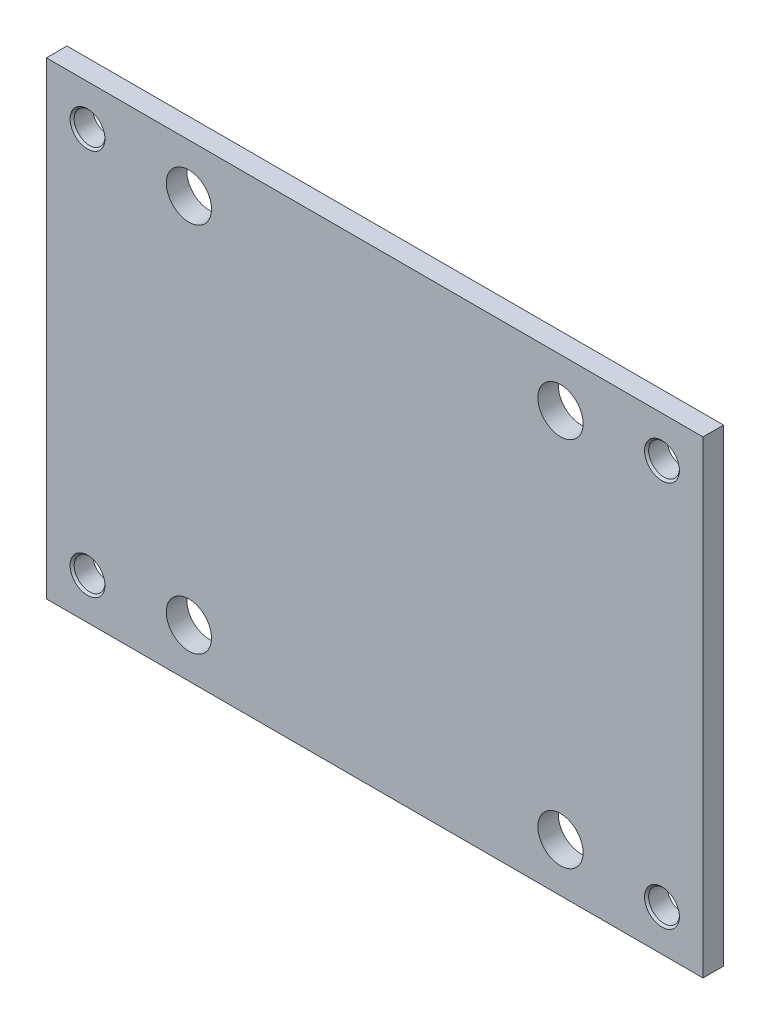
ISO-10303-21;
HEADER;
FILE_DESCRIPTION(('STEP AP214'),'2;1');
FILE_NAME('part.step','',(''),(''),'','','');
FILE_SCHEMA(('AUTOMOTIVE_DESIGN { 1 0 10303 214 1 1 1 1 }'));
ENDSEC;
DATA;
#1=APPLICATION_CONTEXT('core data for automotive mechanical design processes');
#2=APPLICATION_PROTOCOL_DEFINITION('international standard','automotive_design',2000,#1);
#3=PRODUCT_CONTEXT('',#1,'mechanical');
#4=PRODUCT('Part','Part','',(#3));
#5=PRODUCT_RELATED_PRODUCT_CATEGORY('part','',(#4));
#6=PRODUCT_DEFINITION_FORMATION('','',#4);
#7=PRODUCT_DEFINITION_CONTEXT('part definition',#1,'design');
#8=PRODUCT_DEFINITION('design','',#6,#7);
#9=PRODUCT_DEFINITION_SHAPE('','',#8);
#10=(LENGTH_UNIT() NAMED_UNIT(*) SI_UNIT(.MILLI.,.METRE.));
#11=(NAMED_UNIT(*) PLANE_ANGLE_UNIT() SI_UNIT($,.RADIAN.));
#12=(NAMED_UNIT(*) SI_UNIT($,.STERADIAN.) SOLID_ANGLE_UNIT());
#13=UNCERTAINTY_MEASURE_WITH_UNIT(LENGTH_MEASURE(1.E-05),#10,'distance_accuracy_value','');
#14=(GEOMETRIC_REPRESENTATION_CONTEXT(3) GLOBAL_UNCERTAINTY_ASSIGNED_CONTEXT((#13)) GLOBAL_UNIT_ASSIGNED_CONTEXT((#10,
#11,#12)) REPRESENTATION_CONTEXT('',''));
#15=CARTESIAN_POINT('',(0.,0.,0.));
#16=DIRECTION('',(0.,0.,1.));
#17=DIRECTION('',(1.,0.,0.));
#18=AXIS2_PLACEMENT_3D('',#15,#16,#17);
#19=CARTESIAN_POINT('',(101.6,72.517,6.35));
#20=DIRECTION('',(-1.,0.,0.));
#21=DIRECTION('',(0.,-1.,0.));
#22=AXIS2_PLACEMENT_3D('',#19,#20,#21);
#23=PLANE('',#22);
#24=DIRECTION('',(0.,1.,0.));
#25=VECTOR('',#24,1.);
#26=CARTESIAN_POINT('',(101.6,72.517,0.));
#27=LINE('',#26,#25);
#28=CARTESIAN_POINT('',(101.6,-72.517,0.));
#29=VERTEX_POINT('',#28);
#30=CARTESIAN_POINT('',(101.6,72.517,0.));
#31=VERTEX_POINT('',#30);
#32=EDGE_CURVE('E101',#29,#31,#27,.T.);
#33=ORIENTED_EDGE('',*,*,#32,.T.);
#34=DIRECTION('',(0.,0.,-1.));
#35=VECTOR('',#34,1.);
#36=CARTESIAN_POINT('',(101.6,72.517,6.35));
#37=LINE('',#36,#35);
#38=CARTESIAN_POINT('',(101.6,72.517,6.35));
#39=VERTEX_POINT('',#38);
#40=EDGE_CURVE('E11',#39,#31,#37,.T.);
#41=ORIENTED_EDGE('',*,*,#40,.F.);
#42=DIRECTION('',(0.,1.,0.));
#43=VECTOR('',#42,1.);
#44=CARTESIAN_POINT('',(101.6,72.517,6.35));
#45=LINE('',#44,#43);
#46=CARTESIAN_POINT('',(101.6,-72.517,6.35));
#47=VERTEX_POINT('',#46);
#48=EDGE_CURVE('E89',#47,#39,#45,.T.);
#49=ORIENTED_EDGE('',*,*,#48,.F.);
#50=DIRECTION('',(0.,0.,-1.));
#51=VECTOR('',#50,1.);
#52=CARTESIAN_POINT('',(101.6,-72.517,6.35));
#53=LINE('',#52,#51);
#54=EDGE_CURVE('E97',#47,#29,#53,.T.);
#55=ORIENTED_EDGE('',*,*,#54,.T.);
#56=EDGE_LOOP('',(#33,#41,#49,#55));
#57=FACE_BOUND('',#56,.T.);
#58=ADVANCED_FACE('F38',(#57),#23,.F.);
#59=CARTESIAN_POINT('',(-101.6,72.517,6.35));
#60=DIRECTION('',(0.,-1.,0.));
#61=DIRECTION('',(0.,0.,-1.));
#62=AXIS2_PLACEMENT_3D('',#59,#60,#61);
#63=PLANE('',#62);
#64=DIRECTION('',(-1.,0.,0.));
#65=VECTOR('',#64,1.);
#66=CARTESIAN_POINT('',(-101.6,72.517,0.));
#67=LINE('',#66,#65);
#68=CARTESIAN_POINT('',(-101.6,72.517,0.));
#69=VERTEX_POINT('',#68);
#70=EDGE_CURVE('E93',#31,#69,#67,.T.);
#71=ORIENTED_EDGE('',*,*,#70,.T.);
#72=DIRECTION('',(0.,0.,-1.));
#73=VECTOR('',#72,1.);
#74=CARTESIAN_POINT('',(-101.6,72.517,6.35));
#75=LINE('',#74,#73);
#76=CARTESIAN_POINT('',(-101.6,72.517,6.35));
#77=VERTEX_POINT('',#76);
#78=EDGE_CURVE('E46',#77,#69,#75,.T.);
#79=ORIENTED_EDGE('',*,*,#78,.F.);
#80=DIRECTION('',(-1.,0.,0.));
#81=VECTOR('',#80,1.);
#82=CARTESIAN_POINT('',(-101.6,72.517,6.35));
#83=LINE('',#82,#81);
#84=EDGE_CURVE('E84',#39,#77,#83,.T.);
#85=ORIENTED_EDGE('',*,*,#84,.F.);
#86=ORIENTED_EDGE('',*,*,#40,.T.);
#87=EDGE_LOOP('',(#71,#79,#85,#86));
#88=FACE_BOUND('',#87,.T.);
#89=ADVANCED_FACE('F92',(#88),#63,.F.);
#90=CARTESIAN_POINT('',(-101.6,72.517,6.35));
#91=DIRECTION('',(1.,0.,0.));
#92=DIRECTION('',(0.,1.,0.));
#93=AXIS2_PLACEMENT_3D('',#90,#91,#92);
#94=PLANE('',#93);
#95=DIRECTION('',(0.,-1.,0.));
#96=VECTOR('',#95,1.);
#97=CARTESIAN_POINT('',(-101.6,72.517,0.));
#98=LINE('',#97,#96);
#99=CARTESIAN_POINT('',(-101.6,-72.517,0.));
#100=VERTEX_POINT('',#99);
#101=EDGE_CURVE('E71',#69,#100,#98,.T.);
#102=ORIENTED_EDGE('',*,*,#101,.T.);
#103=DIRECTION('',(0.,0.,-1.));
#104=VECTOR('',#103,1.);
#105=CARTESIAN_POINT('',(-101.6,-72.517,6.35));
#106=LINE('',#105,#104);
#107=CARTESIAN_POINT('',(-101.6,-72.517,6.35));
#108=VERTEX_POINT('',#107);
#109=EDGE_CURVE('E94',#108,#100,#106,.T.);
#110=ORIENTED_EDGE('',*,*,#109,.F.);
#111=DIRECTION('',(0.,-1.,0.));
#112=VECTOR('',#111,1.);
#113=CARTESIAN_POINT('',(-101.6,72.517,6.35));
#114=LINE('',#113,#112);
#115=EDGE_CURVE('E87',#77,#108,#114,.T.);
#116=ORIENTED_EDGE('',*,*,#115,.F.);
#117=ORIENTED_EDGE('',*,*,#78,.T.);
#118=EDGE_LOOP('',(#102,#110,#116,#117));
#119=FACE_BOUND('',#118,.T.);
#120=ADVANCED_FACE('F95',(#119),#94,.F.);
#121=CARTESIAN_POINT('',(-101.6,-72.517,6.35));
#122=DIRECTION('',(0.,1.,0.));
#123=DIRECTION('',(0.,0.,1.));
#124=AXIS2_PLACEMENT_3D('',#121,#122,#123);
#125=PLANE('',#124);
#126=DIRECTION('',(1.,0.,0.));
#127=VECTOR('',#126,1.);
#128=CARTESIAN_POINT('',(-101.6,-72.517,0.));
#129=LINE('',#128,#127);
#130=EDGE_CURVE('E77',#100,#29,#129,.T.);
#131=ORIENTED_EDGE('',*,*,#130,.T.);
#132=ORIENTED_EDGE('',*,*,#54,.F.);
#133=DIRECTION('',(1.,0.,0.));
#134=VECTOR('',#133,1.);
#135=CARTESIAN_POINT('',(-101.6,-72.517,6.35));
#136=LINE('',#135,#134);
#137=EDGE_CURVE('E54',#108,#47,#136,.T.);
#138=ORIENTED_EDGE('',*,*,#137,.F.);
#139=ORIENTED_EDGE('',*,*,#109,.T.);
#140=EDGE_LOOP('',(#131,#132,#138,#139));
#141=FACE_BOUND('',#140,.T.);
#142=ADVANCED_FACE('F109',(#141),#125,.F.);
#143=CARTESIAN_POINT('',(0.,0.,6.35));
#144=DIRECTION('',(0.,0.,1.));
#145=DIRECTION('',(1.,0.,0.));
#146=AXIS2_PLACEMENT_3D('',#143,#144,#145);
#147=PLANE('',#146);
#148=CARTESIAN_POINT('',(57.4829999999999,-57.483,6.35));
#149=DIRECTION('',(0.,0.,-1.));
#150=DIRECTION('',(-1.,0.,0.));
#151=AXIS2_PLACEMENT_3D('',#148,#149,#150);
#152=CIRCLE('',#151,7.);
#153=CARTESIAN_POINT('',(50.483,-57.483,6.35));
#154=VERTEX_POINT('',#153);
#155=EDGE_CURVE('E160',#154,#154,#152,.T.);
#156=ORIENTED_EDGE('',*,*,#155,.T.);
#157=EDGE_LOOP('',(#156));
#158=FACE_BOUND('',#157,.T.);
#159=CARTESIAN_POINT('',(-57.5170000000001,-57.483,6.35));
#160=DIRECTION('',(0.,0.,-1.));
#161=DIRECTION('',(-1.,0.,0.));
#162=AXIS2_PLACEMENT_3D('',#159,#160,#161);
#163=CIRCLE('',#162,7.);
#164=CARTESIAN_POINT('',(-64.5170000000001,-57.483,6.35));
#165=VERTEX_POINT('',#164);
#166=EDGE_CURVE('E166',#165,#165,#163,.T.);
#167=ORIENTED_EDGE('',*,*,#166,.T.);
#168=EDGE_LOOP('',(#167));
#169=FACE_BOUND('',#168,.T.);
#170=CARTESIAN_POINT('',(-57.5170000000001,57.517,6.35));
#171=DIRECTION('',(0.,0.,-1.));
#172=DIRECTION('',(-1.,0.,0.));
#173=AXIS2_PLACEMENT_3D('',#170,#171,#172);
#174=CIRCLE('',#173,7.);
#175=CARTESIAN_POINT('',(-64.5170000000001,57.517,6.35));
#176=VERTEX_POINT('',#175);
#177=EDGE_CURVE('E154',#176,#176,#174,.T.);
#178=ORIENTED_EDGE('',*,*,#177,.T.);
#179=EDGE_LOOP('',(#178));
#180=FACE_BOUND('',#179,.T.);
#181=CARTESIAN_POINT('',(57.4829999999999,57.517,6.35));
#182=DIRECTION('',(0.,0.,-1.));
#183=DIRECTION('',(-1.,0.,0.));
#184=AXIS2_PLACEMENT_3D('',#181,#182,#183);
#185=CIRCLE('',#184,7.);
#186=CARTESIAN_POINT('',(50.483,57.517,6.35));
#187=VERTEX_POINT('',#186);
#188=EDGE_CURVE('E150',#187,#187,#185,.T.);
#189=ORIENTED_EDGE('',*,*,#188,.T.);
#190=EDGE_LOOP('',(#189));
#191=FACE_BOUND('',#190,.T.);
#192=CARTESIAN_POINT('',(-88.9,59.817,6.35));
#193=DIRECTION('',(0.,0.,1.));
#194=DIRECTION('',(1.,0.,0.));
#195=AXIS2_PLACEMENT_3D('',#192,#193,#194);
#196=CIRCLE('',#195,5.3975);
#197=CARTESIAN_POINT('',(-83.5025000000001,59.817,6.35));
#198=VERTEX_POINT('',#197);
#199=EDGE_CURVE('E147',#198,#198,#196,.T.);
#200=ORIENTED_EDGE('',*,*,#199,.F.);
#201=EDGE_LOOP('',(#200));
#202=FACE_BOUND('',#201,.T.);
#203=CARTESIAN_POINT('',(-88.9,-59.817,6.35));
#204=DIRECTION('',(0.,0.,1.));
#205=DIRECTION('',(1.,0.,0.));
#206=AXIS2_PLACEMENT_3D('',#203,#204,#205);
#207=CIRCLE('',#206,5.3975);
#208=CARTESIAN_POINT('',(-83.5025000000001,-59.817,6.35));
#209=VERTEX_POINT('',#208);
#210=EDGE_CURVE('E138',#209,#209,#207,.T.);
#211=ORIENTED_EDGE('',*,*,#210,.F.);
#212=EDGE_LOOP('',(#211));
#213=FACE_BOUND('',#212,.T.);
#214=CARTESIAN_POINT('',(88.9,-59.817,6.35));
#215=DIRECTION('',(0.,0.,1.));
#216=DIRECTION('',(1.,0.,0.));
#217=AXIS2_PLACEMENT_3D('',#214,#215,#216);
#218=CIRCLE('',#217,5.3975);
#219=CARTESIAN_POINT('',(94.2975,-59.817,6.35));
#220=VERTEX_POINT('',#219);
#221=EDGE_CURVE('E129',#220,#220,#218,.T.);
#222=ORIENTED_EDGE('',*,*,#221,.F.);
#223=EDGE_LOOP('',(#222));
#224=FACE_BOUND('',#223,.T.);
#225=CARTESIAN_POINT('',(88.8999999999999,59.817,6.35));
#226=DIRECTION('',(0.,0.,1.));
#227=DIRECTION('',(1.,0.,0.));
#228=AXIS2_PLACEMENT_3D('',#225,#226,#227);
#229=CIRCLE('',#228,5.3975);
#230=CARTESIAN_POINT('',(94.2975,59.817,6.35));
#231=VERTEX_POINT('',#230);
#232=EDGE_CURVE('E120',#231,#231,#229,.T.);
#233=ORIENTED_EDGE('',*,*,#232,.F.);
#234=EDGE_LOOP('',(#233));
#235=FACE_BOUND('',#234,.T.);
#236=ORIENTED_EDGE('',*,*,#48,.T.);
#237=ORIENTED_EDGE('',*,*,#84,.T.);
#238=ORIENTED_EDGE('',*,*,#115,.T.);
#239=ORIENTED_EDGE('',*,*,#137,.T.);
#240=EDGE_LOOP('',(#236,#237,#238,#239));
#241=FACE_BOUND('',#240,.T.);
#242=ADVANCED_FACE('F85',(#158,#169,#180,#191,#202,#213,#224,#235,#241),#147,.T.);
#243=CARTESIAN_POINT('',(0.,0.,0.));
#244=DIRECTION('',(0.,0.,1.));
#245=DIRECTION('',(1.,0.,0.));
#246=AXIS2_PLACEMENT_3D('',#243,#244,#245);
#247=PLANE('',#246);
#248=CARTESIAN_POINT('',(57.4829999999999,-57.483,0.));
#249=DIRECTION('',(0.,0.,-1.));
#250=DIRECTION('',(-1.,0.,0.));
#251=AXIS2_PLACEMENT_3D('',#248,#249,#250);
#252=CIRCLE('',#251,7.);
#253=CARTESIAN_POINT('',(50.483,-57.483,0.));
#254=VERTEX_POINT('',#253);
#255=EDGE_CURVE('E157',#254,#254,#252,.T.);
#256=ORIENTED_EDGE('',*,*,#255,.F.);
#257=EDGE_LOOP('',(#256));
#258=FACE_BOUND('',#257,.T.);
#259=CARTESIAN_POINT('',(-57.5170000000001,-57.483,0.));
#260=DIRECTION('',(0.,0.,-1.));
#261=DIRECTION('',(-1.,0.,0.));
#262=AXIS2_PLACEMENT_3D('',#259,#260,#261);
#263=CIRCLE('',#262,7.);
#264=CARTESIAN_POINT('',(-64.5170000000001,-57.483,0.));
#265=VERTEX_POINT('',#264);
#266=EDGE_CURVE('E163',#265,#265,#263,.T.);
#267=ORIENTED_EDGE('',*,*,#266,.F.);
#268=EDGE_LOOP('',(#267));
#269=FACE_BOUND('',#268,.T.);
#270=CARTESIAN_POINT('',(-57.5170000000001,57.517,0.));
#271=DIRECTION('',(0.,0.,-1.));
#272=DIRECTION('',(-1.,0.,0.));
#273=AXIS2_PLACEMENT_3D('',#270,#271,#272);
#274=CIRCLE('',#273,7.);
#275=CARTESIAN_POINT('',(-64.5170000000001,57.517,0.));
#276=VERTEX_POINT('',#275);
#277=EDGE_CURVE('E169',#276,#276,#274,.T.);
#278=ORIENTED_EDGE('',*,*,#277,.F.);
#279=EDGE_LOOP('',(#278));
#280=FACE_BOUND('',#279,.T.);
#281=CARTESIAN_POINT('',(57.4829999999999,57.517,0.));
#282=DIRECTION('',(0.,0.,-1.));
#283=DIRECTION('',(-1.,0.,0.));
#284=AXIS2_PLACEMENT_3D('',#281,#282,#283);
#285=CIRCLE('',#284,7.);
#286=CARTESIAN_POINT('',(50.483,57.517,0.));
#287=VERTEX_POINT('',#286);
#288=EDGE_CURVE('E151',#287,#287,#285,.T.);
#289=ORIENTED_EDGE('',*,*,#288,.F.);
#290=EDGE_LOOP('',(#289));
#291=FACE_BOUND('',#290,.T.);
#292=CARTESIAN_POINT('',(-88.9,59.817,0.));
#293=DIRECTION('',(0.,0.,1.));
#294=DIRECTION('',(1.,0.,0.));
#295=AXIS2_PLACEMENT_3D('',#292,#293,#294);
#296=CIRCLE('',#295,4.7625);
#297=CARTESIAN_POINT('',(-84.1375,59.817,0.));
#298=VERTEX_POINT('',#297);
#299=EDGE_CURVE('E141',#298,#298,#296,.T.);
#300=ORIENTED_EDGE('',*,*,#299,.T.);
#301=EDGE_LOOP('',(#300));
#302=FACE_BOUND('',#301,.T.);
#303=CARTESIAN_POINT('',(-88.9,-59.817,0.));
#304=DIRECTION('',(0.,0.,1.));
#305=DIRECTION('',(1.,0.,0.));
#306=AXIS2_PLACEMENT_3D('',#303,#304,#305);
#307=CIRCLE('',#306,4.7625);
#308=CARTESIAN_POINT('',(-84.1375,-59.817,0.));
#309=VERTEX_POINT('',#308);
#310=EDGE_CURVE('E132',#309,#309,#307,.T.);
#311=ORIENTED_EDGE('',*,*,#310,.T.);
#312=EDGE_LOOP('',(#311));
#313=FACE_BOUND('',#312,.T.);
#314=CARTESIAN_POINT('',(88.9,-59.817,0.));
#315=DIRECTION('',(0.,0.,1.));
#316=DIRECTION('',(1.,0.,0.));
#317=AXIS2_PLACEMENT_3D('',#314,#315,#316);
#318=CIRCLE('',#317,4.7625);
#319=CARTESIAN_POINT('',(93.6625,-59.817,0.));
#320=VERTEX_POINT('',#319);
#321=EDGE_CURVE('E123',#320,#320,#318,.T.);
#322=ORIENTED_EDGE('',*,*,#321,.T.);
#323=EDGE_LOOP('',(#322));
#324=FACE_BOUND('',#323,.T.);
#325=CARTESIAN_POINT('',(88.8999999999999,59.817,0.));
#326=DIRECTION('',(0.,0.,1.));
#327=DIRECTION('',(1.,0.,0.));
#328=AXIS2_PLACEMENT_3D('',#325,#326,#327);
#329=CIRCLE('',#328,4.7625);
#330=CARTESIAN_POINT('',(93.6625,59.817,0.));
#331=VERTEX_POINT('',#330);
#332=EDGE_CURVE('E104',#331,#331,#329,.T.);
#333=ORIENTED_EDGE('',*,*,#332,.T.);
#334=EDGE_LOOP('',(#333));
#335=FACE_BOUND('',#334,.T.);
#336=ORIENTED_EDGE('',*,*,#32,.F.);
#337=ORIENTED_EDGE('',*,*,#130,.F.);
#338=ORIENTED_EDGE('',*,*,#101,.F.);
#339=ORIENTED_EDGE('',*,*,#70,.F.);
#340=EDGE_LOOP('',(#336,#337,#338,#339));
#341=FACE_BOUND('',#340,.T.);
#342=ADVANCED_FACE('F112',(#258,#269,#280,#291,#302,#313,#324,#335,#341),#247,.F.);
#343=CARTESIAN_POINT('',(88.8999999999999,59.817,6.35));
#344=DIRECTION('',(0.,0.,1.));
#345=DIRECTION('',(1.,0.,0.));
#346=AXIS2_PLACEMENT_3D('',#343,#344,#345);
#347=CYLINDRICAL_SURFACE('',#346,4.7625);
#348=ORIENTED_EDGE('',*,*,#332,.F.);
#349=EDGE_LOOP('',(#348));
#350=FACE_BOUND('',#349,.T.);
#351=CARTESIAN_POINT('',(88.8999999999999,59.817,5.715));
#352=DIRECTION('',(0.,0.,1.));
#353=DIRECTION('',(1.,0.,0.));
#354=AXIS2_PLACEMENT_3D('',#351,#352,#353);
#355=CIRCLE('',#354,4.7625);
#356=CARTESIAN_POINT('',(93.6625,59.817,5.715));
#357=VERTEX_POINT('',#356);
#358=EDGE_CURVE('E117',#357,#357,#355,.T.);
#359=ORIENTED_EDGE('',*,*,#358,.T.);
#360=EDGE_LOOP('',(#359));
#361=FACE_BOUND('',#360,.T.);
#362=ADVANCED_FACE('F187',(#350,#361),#347,.F.);
#363=CARTESIAN_POINT('',(88.8999999999999,59.817,6.35));
#364=DIRECTION('',(0.,0.,1.));
#365=DIRECTION('',(1.,0.,0.));
#366=AXIS2_PLACEMENT_3D('',#363,#364,#365);
#367=CONICAL_SURFACE('',#366,5.3975,0.785398163397444);
#368=ORIENTED_EDGE('',*,*,#358,.F.);
#369=EDGE_LOOP('',(#368));
#370=FACE_BOUND('',#369,.T.);
#371=ORIENTED_EDGE('',*,*,#232,.T.);
#372=EDGE_LOOP('',(#371));
#373=FACE_BOUND('',#372,.T.);
#374=ADVANCED_FACE('F202',(#370,#373),#367,.F.);
#375=CARTESIAN_POINT('',(88.9,-59.817,6.35));
#376=DIRECTION('',(0.,0.,1.));
#377=DIRECTION('',(1.,0.,0.));
#378=AXIS2_PLACEMENT_3D('',#375,#376,#377);
#379=CYLINDRICAL_SURFACE('',#378,4.7625);
#380=ORIENTED_EDGE('',*,*,#321,.F.);
#381=EDGE_LOOP('',(#380));
#382=FACE_BOUND('',#381,.T.);
#383=CARTESIAN_POINT('',(88.9,-59.817,5.715));
#384=DIRECTION('',(0.,0.,1.));
#385=DIRECTION('',(1.,0.,0.));
#386=AXIS2_PLACEMENT_3D('',#383,#384,#385);
#387=CIRCLE('',#386,4.7625);
#388=CARTESIAN_POINT('',(93.6625,-59.817,5.715));
#389=VERTEX_POINT('',#388);
#390=EDGE_CURVE('E126',#389,#389,#387,.T.);
#391=ORIENTED_EDGE('',*,*,#390,.T.);
#392=EDGE_LOOP('',(#391));
#393=FACE_BOUND('',#392,.T.);
#394=ADVANCED_FACE('F208',(#382,#393),#379,.F.);
#395=CARTESIAN_POINT('',(88.9,-59.817,6.35));
#396=DIRECTION('',(0.,0.,1.));
#397=DIRECTION('',(1.,0.,0.));
#398=AXIS2_PLACEMENT_3D('',#395,#396,#397);
#399=CONICAL_SURFACE('',#398,5.3975,0.785398163397444);
#400=ORIENTED_EDGE('',*,*,#390,.F.);
#401=EDGE_LOOP('',(#400));
#402=FACE_BOUND('',#401,.T.);
#403=ORIENTED_EDGE('',*,*,#221,.T.);
#404=EDGE_LOOP('',(#403));
#405=FACE_BOUND('',#404,.T.);
#406=ADVANCED_FACE('F257',(#402,#405),#399,.F.);
#407=CARTESIAN_POINT('',(-88.9,-59.817,6.35));
#408=DIRECTION('',(0.,0.,1.));
#409=DIRECTION('',(1.,0.,0.));
#410=AXIS2_PLACEMENT_3D('',#407,#408,#409);
#411=CYLINDRICAL_SURFACE('',#410,4.7625);
#412=ORIENTED_EDGE('',*,*,#310,.F.);
#413=EDGE_LOOP('',(#412));
#414=FACE_BOUND('',#413,.T.);
#415=CARTESIAN_POINT('',(-88.9,-59.817,5.715));
#416=DIRECTION('',(0.,0.,1.));
#417=DIRECTION('',(1.,0.,0.));
#418=AXIS2_PLACEMENT_3D('',#415,#416,#417);
#419=CIRCLE('',#418,4.7625);
#420=CARTESIAN_POINT('',(-84.1375,-59.817,5.715));
#421=VERTEX_POINT('',#420);
#422=EDGE_CURVE('E135',#421,#421,#419,.T.);
#423=ORIENTED_EDGE('',*,*,#422,.T.);
#424=EDGE_LOOP('',(#423));
#425=FACE_BOUND('',#424,.T.);
#426=ADVANCED_FACE('F267',(#414,#425),#411,.F.);
#427=CARTESIAN_POINT('',(-88.9,-59.817,6.35));
#428=DIRECTION('',(0.,0.,1.));
#429=DIRECTION('',(1.,0.,0.));
#430=AXIS2_PLACEMENT_3D('',#427,#428,#429);
#431=CONICAL_SURFACE('',#430,5.3975,0.785398163397444);
#432=ORIENTED_EDGE('',*,*,#422,.F.);
#433=EDGE_LOOP('',(#432));
#434=FACE_BOUND('',#433,.T.);
#435=ORIENTED_EDGE('',*,*,#210,.T.);
#436=EDGE_LOOP('',(#435));
#437=FACE_BOUND('',#436,.T.);
#438=ADVANCED_FACE('F277',(#434,#437),#431,.F.);
#439=CARTESIAN_POINT('',(-88.9,59.817,6.35));
#440=DIRECTION('',(0.,0.,1.));
#441=DIRECTION('',(1.,0.,0.));
#442=AXIS2_PLACEMENT_3D('',#439,#440,#441);
#443=CYLINDRICAL_SURFACE('',#442,4.7625);
#444=ORIENTED_EDGE('',*,*,#299,.F.);
#445=EDGE_LOOP('',(#444));
#446=FACE_BOUND('',#445,.T.);
#447=CARTESIAN_POINT('',(-88.9,59.817,5.715));
#448=DIRECTION('',(0.,0.,1.));
#449=DIRECTION('',(1.,0.,0.));
#450=AXIS2_PLACEMENT_3D('',#447,#448,#449);
#451=CIRCLE('',#450,4.7625);
#452=CARTESIAN_POINT('',(-84.1375,59.817,5.715));
#453=VERTEX_POINT('',#452);
#454=EDGE_CURVE('E144',#453,#453,#451,.T.);
#455=ORIENTED_EDGE('',*,*,#454,.T.);
#456=EDGE_LOOP('',(#455));
#457=FACE_BOUND('',#456,.T.);
#458=ADVANCED_FACE('F287',(#446,#457),#443,.F.);
#459=CARTESIAN_POINT('',(-88.9,59.817,6.35));
#460=DIRECTION('',(0.,0.,1.));
#461=DIRECTION('',(1.,0.,0.));
#462=AXIS2_PLACEMENT_3D('',#459,#460,#461);
#463=CONICAL_SURFACE('',#462,5.3975,0.785398163397444);
#464=ORIENTED_EDGE('',*,*,#454,.F.);
#465=EDGE_LOOP('',(#464));
#466=FACE_BOUND('',#465,.T.);
#467=ORIENTED_EDGE('',*,*,#199,.T.);
#468=EDGE_LOOP('',(#467));
#469=FACE_BOUND('',#468,.T.);
#470=ADVANCED_FACE('F297',(#466,#469),#463,.F.);
#471=CARTESIAN_POINT('',(57.4829999999999,57.517,6.35));
#472=DIRECTION('',(0.,0.,-1.));
#473=DIRECTION('',(-1.,0.,0.));
#474=AXIS2_PLACEMENT_3D('',#471,#472,#473);
#475=CYLINDRICAL_SURFACE('',#474,7.);
#476=CARTESIAN_POINT('',(50.483,57.517,6.35));
#477=CARTESIAN_POINT('',(50.483,57.517,6.28385416666667));
#478=CARTESIAN_POINT('',(50.483,57.517,6.21770833333333));
#479=CARTESIAN_POINT('',(50.483,57.517,6.08541666666667));
#480=CARTESIAN_POINT('',(50.483,57.517,6.01927083333333));
#481=CARTESIAN_POINT('',(50.483,57.517,5.88697916666667));
#482=CARTESIAN_POINT('',(50.483,57.517,5.82083333333333));
#483=CARTESIAN_POINT('',(50.483,57.517,5.68854166666667));
#484=CARTESIAN_POINT('',(50.483,57.517,5.62239583333333));
#485=CARTESIAN_POINT('',(50.483,57.517,5.49010416666667));
#486=CARTESIAN_POINT('',(50.483,57.517,5.42395833333333));
#487=CARTESIAN_POINT('',(50.483,57.517,5.29166666666667));
#488=CARTESIAN_POINT('',(50.483,57.517,5.22552083333333));
#489=CARTESIAN_POINT('',(50.483,57.517,5.09322916666667));
#490=CARTESIAN_POINT('',(50.483,57.517,5.02708333333333));
#491=CARTESIAN_POINT('',(50.483,57.517,4.89479166666667));
#492=CARTESIAN_POINT('',(50.483,57.517,4.82864583333333));
#493=CARTESIAN_POINT('',(50.483,57.517,4.69635416666667));
#494=CARTESIAN_POINT('',(50.483,57.517,4.63020833333333));
#495=CARTESIAN_POINT('',(50.483,57.517,4.49791666666667));
#496=CARTESIAN_POINT('',(50.483,57.517,4.43177083333333));
#497=CARTESIAN_POINT('',(50.483,57.517,4.29947916666667));
#498=CARTESIAN_POINT('',(50.483,57.517,4.23333333333333));
#499=CARTESIAN_POINT('',(50.483,57.517,4.10104166666667));
#500=CARTESIAN_POINT('',(50.483,57.517,4.03489583333333));
#501=CARTESIAN_POINT('',(50.483,57.517,3.90260416666667));
#502=CARTESIAN_POINT('',(50.483,57.517,3.83645833333333));
#503=CARTESIAN_POINT('',(50.483,57.517,3.70416666666667));
#504=CARTESIAN_POINT('',(50.483,57.517,3.63802083333333));
#505=CARTESIAN_POINT('',(50.483,57.517,3.50572916666667));
#506=CARTESIAN_POINT('',(50.483,57.517,3.43958333333333));
#507=CARTESIAN_POINT('',(50.483,57.517,3.30729166666667));
#508=CARTESIAN_POINT('',(50.483,57.517,3.24114583333333));
#509=CARTESIAN_POINT('',(50.483,57.517,3.10885416666667));
#510=CARTESIAN_POINT('',(50.483,57.517,3.04270833333333));
#511=CARTESIAN_POINT('',(50.483,57.517,2.91041666666667));
#512=CARTESIAN_POINT('',(50.483,57.517,2.84427083333333));
#513=CARTESIAN_POINT('',(50.483,57.517,2.71197916666667));
#514=CARTESIAN_POINT('',(50.483,57.517,2.64583333333333));
#515=CARTESIAN_POINT('',(50.483,57.517,2.51354166666667));
#516=CARTESIAN_POINT('',(50.483,57.517,2.44739583333333));
#517=CARTESIAN_POINT('',(50.483,57.517,2.31510416666667));
#518=CARTESIAN_POINT('',(50.483,57.517,2.24895833333333));
#519=CARTESIAN_POINT('',(50.483,57.517,2.11666666666667));
#520=CARTESIAN_POINT('',(50.483,57.517,2.05052083333333));
#521=CARTESIAN_POINT('',(50.483,57.517,1.91822916666667));
#522=CARTESIAN_POINT('',(50.483,57.517,1.85208333333333));
#523=CARTESIAN_POINT('',(50.483,57.517,1.71979166666667));
#524=CARTESIAN_POINT('',(50.483,57.517,1.65364583333333));
#525=CARTESIAN_POINT('',(50.483,57.517,1.52135416666667));
#526=CARTESIAN_POINT('',(50.483,57.517,1.45520833333333));
#527=CARTESIAN_POINT('',(50.483,57.517,1.32291666666667));
#528=CARTESIAN_POINT('',(50.483,57.517,1.25677083333333));
#529=CARTESIAN_POINT('',(50.483,57.517,1.12447916666667));
#530=CARTESIAN_POINT('',(50.483,57.517,1.05833333333333));
#531=CARTESIAN_POINT('',(50.483,57.517,0.926041666666667));
#532=CARTESIAN_POINT('',(50.483,57.517,0.859895833333334));
#533=CARTESIAN_POINT('',(50.483,57.517,0.727604166666667));
#534=CARTESIAN_POINT('',(50.483,57.517,0.661458333333334));
#535=CARTESIAN_POINT('',(50.483,57.517,0.529166666666667));
#536=CARTESIAN_POINT('',(50.483,57.517,0.463020833333333));
#537=CARTESIAN_POINT('',(50.483,57.517,0.330729166666666));
#538=CARTESIAN_POINT('',(50.483,57.517,0.264583333333333));
#539=CARTESIAN_POINT('',(50.483,57.517,0.132291666666667));
#540=CARTESIAN_POINT('',(50.483,57.517,0.0661458333333333));
#541=CARTESIAN_POINT('',(50.483,57.517,0.));
#542=B_SPLINE_CURVE_WITH_KNOTS('',3,(#476,#477,#478,#479,#480,#481,#482,#483,#484,#485,#486,
#487,#488,#489,#490,#491,#492,#493,#494,#495,#496,#497,#498,#499,#500,#501,#502,#503,#504,#505,
#506,#507,#508,#509,#510,#511,#512,#513,#514,#515,#516,#517,#518,#519,#520,#521,#522,#523,#524,
#525,#526,#527,#528,#529,#530,#531,#532,#533,#534,#535,#536,#537,#538,#539,#540,#541),
.UNSPECIFIED.,.F.,.F.,(4,2,2,2,2,2,2,2,2,2,2,2,2,2,2,2,2,2,2,2,2,2,2,2,2,2,2,2,2,2,2,2,4),(0.,
0.1984375,0.396875,0.595312499999999,0.793749999999999,0.992187499999999,1.190625,1.3890625,
1.5875,1.7859375,1.984375,2.1828125,2.38125,2.5796875,2.778125,2.9765625,3.175,3.3734375,
3.571875,3.7703125,3.96875,4.1671875,4.365625,4.5640625,4.7625,4.9609375,5.159375,5.3578125,
5.55625,5.7546875,5.953125,6.1515625,6.35),.UNSPECIFIED.);
#543=EDGE_CURVE('BSEAM181',#187,#287,#542,.T.);
#544=ORIENTED_EDGE('',*,*,#188,.F.);
#545=ORIENTED_EDGE('',*,*,#288,.T.);
#546=ORIENTED_EDGE('',*,*,#543,.T.);
#547=ORIENTED_EDGE('',*,*,#543,.F.);
#548=EDGE_LOOP('',(#544,#546,#545,#547));
#549=FACE_BOUND('',#548,.T.);
#550=ADVANCED_FACE('F181',(#549),#475,.F.);
#551=CARTESIAN_POINT('',(-57.5170000000001,57.517,6.35));
#552=DIRECTION('',(0.,0.,-1.));
#553=DIRECTION('',(-1.,0.,0.));
#554=AXIS2_PLACEMENT_3D('',#551,#552,#553);
#555=CYLINDRICAL_SURFACE('',#554,7.);
#556=CARTESIAN_POINT('',(-64.5170000000001,57.517,6.35));
#557=CARTESIAN_POINT('',(-64.5170000000001,57.517,6.28385416666667));
#558=CARTESIAN_POINT('',(-64.5170000000001,57.517,6.21770833333333));
#559=CARTESIAN_POINT('',(-64.5170000000001,57.517,6.08541666666667));
#560=CARTESIAN_POINT('',(-64.5170000000001,57.517,6.01927083333333));
#561=CARTESIAN_POINT('',(-64.5170000000001,57.517,5.88697916666667));
#562=CARTESIAN_POINT('',(-64.5170000000001,57.517,5.82083333333333));
#563=CARTESIAN_POINT('',(-64.5170000000001,57.517,5.68854166666667));
#564=CARTESIAN_POINT('',(-64.5170000000001,57.517,5.62239583333333));
#565=CARTESIAN_POINT('',(-64.5170000000001,57.517,5.49010416666667));
#566=CARTESIAN_POINT('',(-64.5170000000001,57.517,5.42395833333333));
#567=CARTESIAN_POINT('',(-64.5170000000001,57.517,5.29166666666667));
#568=CARTESIAN_POINT('',(-64.5170000000001,57.517,5.22552083333333));
#569=CARTESIAN_POINT('',(-64.5170000000001,57.517,5.09322916666667));
#570=CARTESIAN_POINT('',(-64.5170000000001,57.517,5.02708333333333));
#571=CARTESIAN_POINT('',(-64.5170000000001,57.517,4.89479166666667));
#572=CARTESIAN_POINT('',(-64.5170000000001,57.517,4.82864583333333));
#573=CARTESIAN_POINT('',(-64.5170000000001,57.517,4.69635416666667));
#574=CARTESIAN_POINT('',(-64.5170000000001,57.517,4.63020833333333));
#575=CARTESIAN_POINT('',(-64.5170000000001,57.517,4.49791666666667));
#576=CARTESIAN_POINT('',(-64.5170000000001,57.517,4.43177083333333));
#577=CARTESIAN_POINT('',(-64.5170000000001,57.517,4.29947916666667));
#578=CARTESIAN_POINT('',(-64.5170000000001,57.517,4.23333333333333));
#579=CARTESIAN_POINT('',(-64.5170000000001,57.517,4.10104166666667));
#580=CARTESIAN_POINT('',(-64.5170000000001,57.517,4.03489583333333));
#581=CARTESIAN_POINT('',(-64.5170000000001,57.517,3.90260416666667));
#582=CARTESIAN_POINT('',(-64.5170000000001,57.517,3.83645833333333));
#583=CARTESIAN_POINT('',(-64.5170000000001,57.517,3.70416666666667));
#584=CARTESIAN_POINT('',(-64.5170000000001,57.517,3.63802083333333));
#585=CARTESIAN_POINT('',(-64.5170000000001,57.517,3.50572916666667));
#586=CARTESIAN_POINT('',(-64.5170000000001,57.517,3.43958333333333));
#587=CARTESIAN_POINT('',(-64.5170000000001,57.517,3.30729166666667));
#588=CARTESIAN_POINT('',(-64.5170000000001,57.517,3.24114583333333));
#589=CARTESIAN_POINT('',(-64.5170000000001,57.517,3.10885416666667));
#590=CARTESIAN_POINT('',(-64.5170000000001,57.517,3.04270833333333));
#591=CARTESIAN_POINT('',(-64.5170000000001,57.517,2.91041666666667));
#592=CARTESIAN_POINT('',(-64.5170000000001,57.517,2.84427083333333));
#593=CARTESIAN_POINT('',(-64.5170000000001,57.517,2.71197916666667));
#594=CARTESIAN_POINT('',(-64.5170000000001,57.517,2.64583333333333));
#595=CARTESIAN_POINT('',(-64.5170000000001,57.517,2.51354166666667));
#596=CARTESIAN_POINT('',(-64.5170000000001,57.517,2.44739583333333));
#597=CARTESIAN_POINT('',(-64.5170000000001,57.517,2.31510416666667));
#598=CARTESIAN_POINT('',(-64.5170000000001,57.517,2.24895833333333));
#599=CARTESIAN_POINT('',(-64.5170000000001,57.517,2.11666666666667));
#600=CARTESIAN_POINT('',(-64.5170000000001,57.517,2.05052083333333));
#601=CARTESIAN_POINT('',(-64.5170000000001,57.517,1.91822916666667));
#602=CARTESIAN_POINT('',(-64.5170000000001,57.517,1.85208333333333));
#603=CARTESIAN_POINT('',(-64.5170000000001,57.517,1.71979166666667));
#604=CARTESIAN_POINT('',(-64.5170000000001,57.517,1.65364583333333));
#605=CARTESIAN_POINT('',(-64.5170000000001,57.517,1.52135416666667));
#606=CARTESIAN_POINT('',(-64.5170000000001,57.517,1.45520833333333));
#607=CARTESIAN_POINT('',(-64.5170000000001,57.517,1.32291666666667));
#608=CARTESIAN_POINT('',(-64.5170000000001,57.517,1.25677083333333));
#609=CARTESIAN_POINT('',(-64.5170000000001,57.517,1.12447916666667));
#610=CARTESIAN_POINT('',(-64.5170000000001,57.517,1.05833333333333));
#611=CARTESIAN_POINT('',(-64.5170000000001,57.517,0.926041666666667));
#612=CARTESIAN_POINT('',(-64.5170000000001,57.517,0.859895833333334));
#613=CARTESIAN_POINT('',(-64.5170000000001,57.517,0.727604166666667));
#614=CARTESIAN_POINT('',(-64.5170000000001,57.517,0.661458333333334));
#615=CARTESIAN_POINT('',(-64.5170000000001,57.517,0.529166666666667));
#616=CARTESIAN_POINT('',(-64.5170000000001,57.517,0.463020833333333));
#617=CARTESIAN_POINT('',(-64.5170000000001,57.517,0.330729166666666));
#618=CARTESIAN_POINT('',(-64.5170000000001,57.517,0.264583333333333));
#619=CARTESIAN_POINT('',(-64.5170000000001,57.517,0.132291666666667));
#620=CARTESIAN_POINT('',(-64.5170000000001,57.517,0.0661458333333333));
#621=CARTESIAN_POINT('',(-64.5170000000001,57.517,0.));
#622=B_SPLINE_CURVE_WITH_KNOTS('',3,(#556,#557,#558,#559,#560,#561,#562,#563,#564,#565,#566,
#567,#568,#569,#570,#571,#572,#573,#574,#575,#576,#577,#578,#579,#580,#581,#582,#583,#584,#585,
#586,#587,#588,#589,#590,#591,#592,#593,#594,#595,#596,#597,#598,#599,#600,#601,#602,#603,#604,
#605,#606,#607,#608,#609,#610,#611,#612,#613,#614,#615,#616,#617,#618,#619,#620,#621),
.UNSPECIFIED.,.F.,.F.,(4,2,2,2,2,2,2,2,2,2,2,2,2,2,2,2,2,2,2,2,2,2,2,2,2,2,2,2,2,2,2,2,4),(0.,
0.1984375,0.396875,0.595312499999999,0.793749999999999,0.992187499999999,1.190625,1.3890625,
1.5875,1.7859375,1.984375,2.1828125,2.38125,2.5796875,2.778125,2.9765625,3.175,3.3734375,
3.571875,3.7703125,3.96875,4.1671875,4.365625,4.5640625,4.7625,4.9609375,5.159375,5.3578125,
5.55625,5.7546875,5.953125,6.1515625,6.35),.UNSPECIFIED.);
#623=EDGE_CURVE('BSEAM177',#176,#276,#622,.T.);
#624=ORIENTED_EDGE('',*,*,#177,.F.);
#625=ORIENTED_EDGE('',*,*,#277,.T.);
#626=ORIENTED_EDGE('',*,*,#623,.T.);
#627=ORIENTED_EDGE('',*,*,#623,.F.);
#628=EDGE_LOOP('',(#624,#626,#625,#627));
#629=FACE_BOUND('',#628,.T.);
#630=ADVANCED_FACE('F177',(#629),#555,.F.);
#631=CARTESIAN_POINT('',(-57.5170000000001,-57.483,6.35));
#632=DIRECTION('',(0.,0.,-1.));
#633=DIRECTION('',(-1.,0.,0.));
#634=AXIS2_PLACEMENT_3D('',#631,#632,#633);
#635=CYLINDRICAL_SURFACE('',#634,7.);
#636=CARTESIAN_POINT('',(-64.5170000000001,-57.483,6.35));
#637=CARTESIAN_POINT('',(-64.5170000000001,-57.483,6.28385416666667));
#638=CARTESIAN_POINT('',(-64.5170000000001,-57.483,6.21770833333333));
#639=CARTESIAN_POINT('',(-64.5170000000001,-57.483,6.08541666666667));
#640=CARTESIAN_POINT('',(-64.5170000000001,-57.483,6.01927083333333));
#641=CARTESIAN_POINT('',(-64.5170000000001,-57.483,5.88697916666667));
#642=CARTESIAN_POINT('',(-64.5170000000001,-57.483,5.82083333333333));
#643=CARTESIAN_POINT('',(-64.5170000000001,-57.483,5.68854166666667));
#644=CARTESIAN_POINT('',(-64.5170000000001,-57.483,5.62239583333333));
#645=CARTESIAN_POINT('',(-64.5170000000001,-57.483,5.49010416666667));
#646=CARTESIAN_POINT('',(-64.5170000000001,-57.483,5.42395833333333));
#647=CARTESIAN_POINT('',(-64.5170000000001,-57.483,5.29166666666667));
#648=CARTESIAN_POINT('',(-64.5170000000001,-57.483,5.22552083333333));
#649=CARTESIAN_POINT('',(-64.5170000000001,-57.483,5.09322916666667));
#650=CARTESIAN_POINT('',(-64.5170000000001,-57.483,5.02708333333333));
#651=CARTESIAN_POINT('',(-64.5170000000001,-57.483,4.89479166666667));
#652=CARTESIAN_POINT('',(-64.5170000000001,-57.483,4.82864583333333));
#653=CARTESIAN_POINT('',(-64.5170000000001,-57.483,4.69635416666667));
#654=CARTESIAN_POINT('',(-64.5170000000001,-57.483,4.63020833333333));
#655=CARTESIAN_POINT('',(-64.5170000000001,-57.483,4.49791666666667));
#656=CARTESIAN_POINT('',(-64.5170000000001,-57.483,4.43177083333333));
#657=CARTESIAN_POINT('',(-64.5170000000001,-57.483,4.29947916666667));
#658=CARTESIAN_POINT('',(-64.5170000000001,-57.483,4.23333333333333));
#659=CARTESIAN_POINT('',(-64.5170000000001,-57.483,4.10104166666667));
#660=CARTESIAN_POINT('',(-64.5170000000001,-57.483,4.03489583333333));
#661=CARTESIAN_POINT('',(-64.5170000000001,-57.483,3.90260416666667));
#662=CARTESIAN_POINT('',(-64.5170000000001,-57.483,3.83645833333333));
#663=CARTESIAN_POINT('',(-64.5170000000001,-57.483,3.70416666666667));
#664=CARTESIAN_POINT('',(-64.5170000000001,-57.483,3.63802083333333));
#665=CARTESIAN_POINT('',(-64.5170000000001,-57.483,3.50572916666667));
#666=CARTESIAN_POINT('',(-64.5170000000001,-57.483,3.43958333333333));
#667=CARTESIAN_POINT('',(-64.5170000000001,-57.483,3.30729166666667));
#668=CARTESIAN_POINT('',(-64.5170000000001,-57.483,3.24114583333333));
#669=CARTESIAN_POINT('',(-64.5170000000001,-57.483,3.10885416666667));
#670=CARTESIAN_POINT('',(-64.5170000000001,-57.483,3.04270833333333));
#671=CARTESIAN_POINT('',(-64.5170000000001,-57.483,2.91041666666667));
#672=CARTESIAN_POINT('',(-64.5170000000001,-57.483,2.84427083333333));
#673=CARTESIAN_POINT('',(-64.5170000000001,-57.483,2.71197916666667));
#674=CARTESIAN_POINT('',(-64.5170000000001,-57.483,2.64583333333333));
#675=CARTESIAN_POINT('',(-64.5170000000001,-57.483,2.51354166666667));
#676=CARTESIAN_POINT('',(-64.5170000000001,-57.483,2.44739583333333));
#677=CARTESIAN_POINT('',(-64.5170000000001,-57.483,2.31510416666667));
#678=CARTESIAN_POINT('',(-64.5170000000001,-57.483,2.24895833333333));
#679=CARTESIAN_POINT('',(-64.5170000000001,-57.483,2.11666666666667));
#680=CARTESIAN_POINT('',(-64.5170000000001,-57.483,2.05052083333333));
#681=CARTESIAN_POINT('',(-64.5170000000001,-57.483,1.91822916666667));
#682=CARTESIAN_POINT('',(-64.5170000000001,-57.483,1.85208333333333));
#683=CARTESIAN_POINT('',(-64.5170000000001,-57.483,1.71979166666667));
#684=CARTESIAN_POINT('',(-64.5170000000001,-57.483,1.65364583333333));
#685=CARTESIAN_POINT('',(-64.5170000000001,-57.483,1.52135416666667));
#686=CARTESIAN_POINT('',(-64.5170000000001,-57.483,1.45520833333333));
#687=CARTESIAN_POINT('',(-64.5170000000001,-57.483,1.32291666666667));
#688=CARTESIAN_POINT('',(-64.5170000000001,-57.483,1.25677083333333));
#689=CARTESIAN_POINT('',(-64.5170000000001,-57.483,1.12447916666667));
#690=CARTESIAN_POINT('',(-64.5170000000001,-57.483,1.05833333333333));
#691=CARTESIAN_POINT('',(-64.5170000000001,-57.483,0.926041666666667));
#692=CARTESIAN_POINT('',(-64.5170000000001,-57.483,0.859895833333334));
#693=CARTESIAN_POINT('',(-64.5170000000001,-57.483,0.727604166666667));
#694=CARTESIAN_POINT('',(-64.5170000000001,-57.483,0.661458333333334));
#695=CARTESIAN_POINT('',(-64.5170000000001,-57.483,0.529166666666667));
#696=CARTESIAN_POINT('',(-64.5170000000001,-57.483,0.463020833333333));
#697=CARTESIAN_POINT('',(-64.5170000000001,-57.483,0.330729166666666));
#698=CARTESIAN_POINT('',(-64.5170000000001,-57.483,0.264583333333333));
#699=CARTESIAN_POINT('',(-64.5170000000001,-57.483,0.132291666666667));
#700=CARTESIAN_POINT('',(-64.5170000000001,-57.483,0.0661458333333333));
#701=CARTESIAN_POINT('',(-64.5170000000001,-57.483,0.));
#702=B_SPLINE_CURVE_WITH_KNOTS('',3,(#636,#637,#638,#639,#640,#641,#642,#643,#644,#645,#646,
#647,#648,#649,#650,#651,#652,#653,#654,#655,#656,#657,#658,#659,#660,#661,#662,#663,#664,#665,
#666,#667,#668,#669,#670,#671,#672,#673,#674,#675,#676,#677,#678,#679,#680,#681,#682,#683,#684,
#685,#686,#687,#688,#689,#690,#691,#692,#693,#694,#695,#696,#697,#698,#699,#700,#701),
.UNSPECIFIED.,.F.,.F.,(4,2,2,2,2,2,2,2,2,2,2,2,2,2,2,2,2,2,2,2,2,2,2,2,2,2,2,2,2,2,2,2,4),(0.,
0.1984375,0.396875,0.595312499999999,0.793749999999999,0.992187499999999,1.190625,1.3890625,
1.5875,1.7859375,1.984375,2.1828125,2.38125,2.5796875,2.778125,2.9765625,3.175,3.3734375,
3.571875,3.7703125,3.96875,4.1671875,4.365625,4.5640625,4.7625,4.9609375,5.159375,5.3578125,
5.55625,5.7546875,5.953125,6.1515625,6.35),.UNSPECIFIED.);
#703=EDGE_CURVE('BSEAM180',#165,#265,#702,.T.);
#704=ORIENTED_EDGE('',*,*,#166,.F.);
#705=ORIENTED_EDGE('',*,*,#266,.T.);
#706=ORIENTED_EDGE('',*,*,#703,.T.);
#707=ORIENTED_EDGE('',*,*,#703,.F.);
#708=EDGE_LOOP('',(#704,#706,#705,#707));
#709=FACE_BOUND('',#708,.T.);
#710=ADVANCED_FACE('F180',(#709),#635,.F.);
#711=CARTESIAN_POINT('',(57.4829999999999,-57.483,6.35));
#712=DIRECTION('',(0.,0.,-1.));
#713=DIRECTION('',(-1.,0.,0.));
#714=AXIS2_PLACEMENT_3D('',#711,#712,#713);
#715=CYLINDRICAL_SURFACE('',#714,7.);
#716=CARTESIAN_POINT('',(50.483,-57.483,6.35));
#717=CARTESIAN_POINT('',(50.483,-57.483,6.28385416666667));
#718=CARTESIAN_POINT('',(50.483,-57.483,6.21770833333333));
#719=CARTESIAN_POINT('',(50.483,-57.483,6.08541666666667));
#720=CARTESIAN_POINT('',(50.483,-57.483,6.01927083333333));
#721=CARTESIAN_POINT('',(50.483,-57.483,5.88697916666667));
#722=CARTESIAN_POINT('',(50.483,-57.483,5.82083333333333));
#723=CARTESIAN_POINT('',(50.483,-57.483,5.68854166666667));
#724=CARTESIAN_POINT('',(50.483,-57.483,5.62239583333333));
#725=CARTESIAN_POINT('',(50.483,-57.483,5.49010416666667));
#726=CARTESIAN_POINT('',(50.483,-57.483,5.42395833333333));
#727=CARTESIAN_POINT('',(50.483,-57.483,5.29166666666667));
#728=CARTESIAN_POINT('',(50.483,-57.483,5.22552083333333));
#729=CARTESIAN_POINT('',(50.483,-57.483,5.09322916666667));
#730=CARTESIAN_POINT('',(50.483,-57.483,5.02708333333333));
#731=CARTESIAN_POINT('',(50.483,-57.483,4.89479166666667));
#732=CARTESIAN_POINT('',(50.483,-57.483,4.82864583333333));
#733=CARTESIAN_POINT('',(50.483,-57.483,4.69635416666667));
#734=CARTESIAN_POINT('',(50.483,-57.483,4.63020833333333));
#735=CARTESIAN_POINT('',(50.483,-57.483,4.49791666666667));
#736=CARTESIAN_POINT('',(50.483,-57.483,4.43177083333333));
#737=CARTESIAN_POINT('',(50.483,-57.483,4.29947916666667));
#738=CARTESIAN_POINT('',(50.483,-57.483,4.23333333333333));
#739=CARTESIAN_POINT('',(50.483,-57.483,4.10104166666667));
#740=CARTESIAN_POINT('',(50.483,-57.483,4.03489583333333));
#741=CARTESIAN_POINT('',(50.483,-57.483,3.90260416666667));
#742=CARTESIAN_POINT('',(50.483,-57.483,3.83645833333333));
#743=CARTESIAN_POINT('',(50.483,-57.483,3.70416666666667));
#744=CARTESIAN_POINT('',(50.483,-57.483,3.63802083333333));
#745=CARTESIAN_POINT('',(50.483,-57.483,3.50572916666667));
#746=CARTESIAN_POINT('',(50.483,-57.483,3.43958333333333));
#747=CARTESIAN_POINT('',(50.483,-57.483,3.30729166666667));
#748=CARTESIAN_POINT('',(50.483,-57.483,3.24114583333333));
#749=CARTESIAN_POINT('',(50.483,-57.483,3.10885416666667));
#750=CARTESIAN_POINT('',(50.483,-57.483,3.04270833333333));
#751=CARTESIAN_POINT('',(50.483,-57.483,2.91041666666667));
#752=CARTESIAN_POINT('',(50.483,-57.483,2.84427083333333));
#753=CARTESIAN_POINT('',(50.483,-57.483,2.71197916666667));
#754=CARTESIAN_POINT('',(50.483,-57.483,2.64583333333333));
#755=CARTESIAN_POINT('',(50.483,-57.483,2.51354166666667));
#756=CARTESIAN_POINT('',(50.483,-57.483,2.44739583333333));
#757=CARTESIAN_POINT('',(50.483,-57.483,2.31510416666667));
#758=CARTESIAN_POINT('',(50.483,-57.483,2.24895833333333));
#759=CARTESIAN_POINT('',(50.483,-57.483,2.11666666666667));
#760=CARTESIAN_POINT('',(50.483,-57.483,2.05052083333333));
#761=CARTESIAN_POINT('',(50.483,-57.483,1.91822916666667));
#762=CARTESIAN_POINT('',(50.483,-57.483,1.85208333333333));
#763=CARTESIAN_POINT('',(50.483,-57.483,1.71979166666667));
#764=CARTESIAN_POINT('',(50.483,-57.483,1.65364583333333));
#765=CARTESIAN_POINT('',(50.483,-57.483,1.52135416666667));
#766=CARTESIAN_POINT('',(50.483,-57.483,1.45520833333333));
#767=CARTESIAN_POINT('',(50.483,-57.483,1.32291666666667));
#768=CARTESIAN_POINT('',(50.483,-57.483,1.25677083333333));
#769=CARTESIAN_POINT('',(50.483,-57.483,1.12447916666667));
#770=CARTESIAN_POINT('',(50.483,-57.483,1.05833333333333));
#771=CARTESIAN_POINT('',(50.483,-57.483,0.926041666666667));
#772=CARTESIAN_POINT('',(50.483,-57.483,0.859895833333334));
#773=CARTESIAN_POINT('',(50.483,-57.483,0.727604166666667));
#774=CARTESIAN_POINT('',(50.483,-57.483,0.661458333333334));
#775=CARTESIAN_POINT('',(50.483,-57.483,0.529166666666667));
#776=CARTESIAN_POINT('',(50.483,-57.483,0.463020833333333));
#777=CARTESIAN_POINT('',(50.483,-57.483,0.330729166666666));
#778=CARTESIAN_POINT('',(50.483,-57.483,0.264583333333333));
#779=CARTESIAN_POINT('',(50.483,-57.483,0.132291666666667));
#780=CARTESIAN_POINT('',(50.483,-57.483,0.0661458333333333));
#781=CARTESIAN_POINT('',(50.483,-57.483,0.));
#782=B_SPLINE_CURVE_WITH_KNOTS('',3,(#716,#717,#718,#719,#720,#721,#722,#723,#724,#725,#726,
#727,#728,#729,#730,#731,#732,#733,#734,#735,#736,#737,#738,#739,#740,#741,#742,#743,#744,#745,
#746,#747,#748,#749,#750,#751,#752,#753,#754,#755,#756,#757,#758,#759,#760,#761,#762,#763,#764,
#765,#766,#767,#768,#769,#770,#771,#772,#773,#774,#775,#776,#777,#778,#779,#780,#781),
.UNSPECIFIED.,.F.,.F.,(4,2,2,2,2,2,2,2,2,2,2,2,2,2,2,2,2,2,2,2,2,2,2,2,2,2,2,2,2,2,2,2,4),(0.,
0.1984375,0.396875,0.595312499999999,0.793749999999999,0.992187499999999,1.190625,1.3890625,
1.5875,1.7859375,1.984375,2.1828125,2.38125,2.5796875,2.778125,2.9765625,3.175,3.3734375,
3.571875,3.7703125,3.96875,4.1671875,4.365625,4.5640625,4.7625,4.9609375,5.159375,5.3578125,
5.55625,5.7546875,5.953125,6.1515625,6.35),.UNSPECIFIED.);
#783=EDGE_CURVE('BSEAM339',#154,#254,#782,.T.);
#784=ORIENTED_EDGE('',*,*,#155,.F.);
#785=ORIENTED_EDGE('',*,*,#255,.T.);
#786=ORIENTED_EDGE('',*,*,#783,.T.);
#787=ORIENTED_EDGE('',*,*,#783,.F.);
#788=EDGE_LOOP('',(#784,#786,#785,#787));
#789=FACE_BOUND('',#788,.T.);
#790=ADVANCED_FACE('F339',(#789),#715,.F.);
#791=CLOSED_SHELL('',(#58,#89,#120,#142,#242,#342,#362,#374,#394,#406,#426,#438,#458,#470,#550,
#630,#710,#790));
#792=MANIFOLD_SOLID_BREP('B2',#791);
#793=ADVANCED_BREP_SHAPE_REPRESENTATION('',(#18,#792),#14);
#794=SHAPE_DEFINITION_REPRESENTATION(#9,#793);
ENDSEC;
END-ISO-10303-21;
